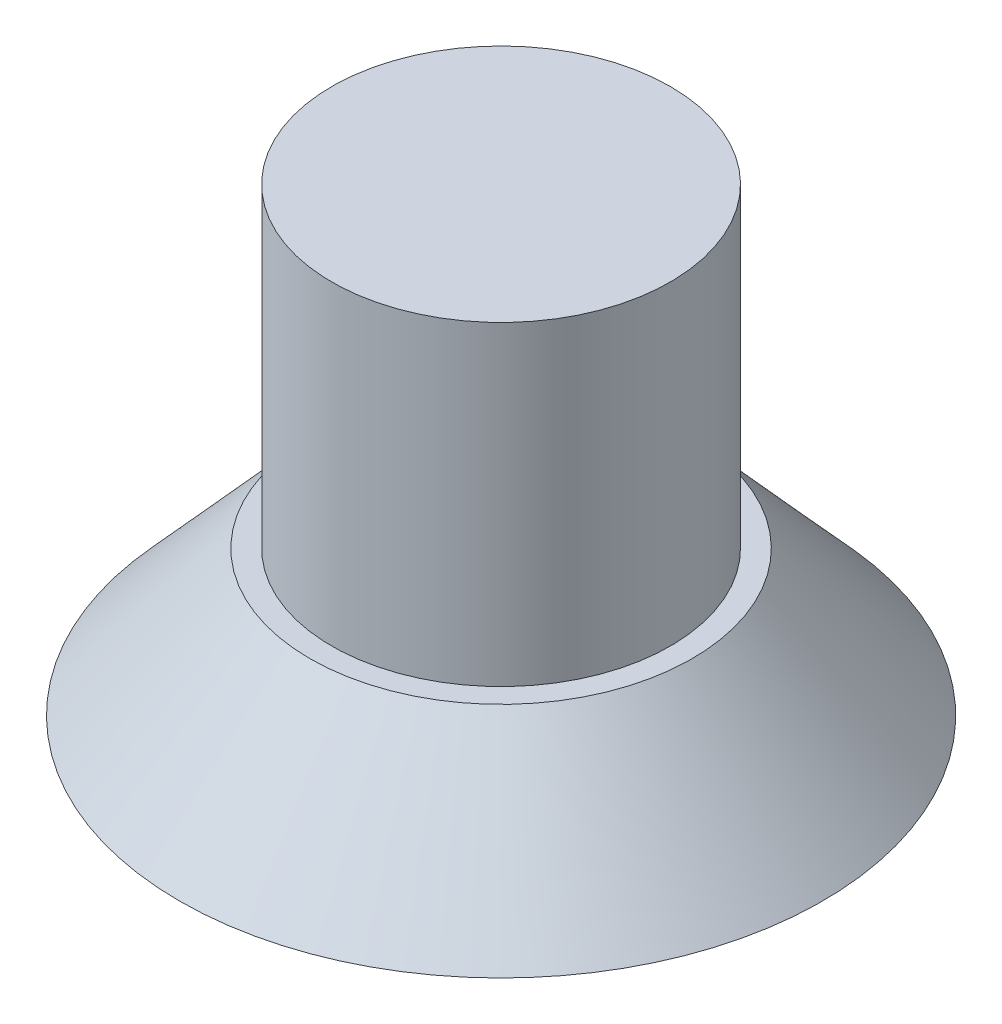
ISO-10303-21;
HEADER;
FILE_DESCRIPTION(('STEP AP214'),'2;1');
FILE_NAME('part.step','',(''),(''),'','','');
FILE_SCHEMA(('AUTOMOTIVE_DESIGN { 1 0 10303 214 1 1 1 1 }'));
ENDSEC;
DATA;
#1=APPLICATION_CONTEXT('core data for automotive mechanical design processes');
#2=APPLICATION_PROTOCOL_DEFINITION('international standard','automotive_design',2000,#1);
#3=PRODUCT_CONTEXT('',#1,'mechanical');
#4=PRODUCT('Part','Part','',(#3));
#5=PRODUCT_RELATED_PRODUCT_CATEGORY('part','',(#4));
#6=PRODUCT_DEFINITION_FORMATION('','',#4);
#7=PRODUCT_DEFINITION_CONTEXT('part definition',#1,'design');
#8=PRODUCT_DEFINITION('design','',#6,#7);
#9=PRODUCT_DEFINITION_SHAPE('','',#8);
#10=(LENGTH_UNIT() NAMED_UNIT(*) SI_UNIT(.MILLI.,.METRE.));
#11=(NAMED_UNIT(*) PLANE_ANGLE_UNIT() SI_UNIT($,.RADIAN.));
#12=(NAMED_UNIT(*) SI_UNIT($,.STERADIAN.) SOLID_ANGLE_UNIT());
#13=UNCERTAINTY_MEASURE_WITH_UNIT(LENGTH_MEASURE(1.E-05),#10,'distance_accuracy_value','');
#14=(GEOMETRIC_REPRESENTATION_CONTEXT(3) GLOBAL_UNCERTAINTY_ASSIGNED_CONTEXT((#13)) GLOBAL_UNIT_ASSIGNED_CONTEXT((#10,
#11,#12)) REPRESENTATION_CONTEXT('',''));
#15=CARTESIAN_POINT('',(0.,0.,0.));
#16=DIRECTION('',(0.,0.,1.));
#17=DIRECTION('',(1.,0.,0.));
#18=AXIS2_PLACEMENT_3D('',#15,#16,#17);
#19=CARTESIAN_POINT('',(0.,0.,0.));
#20=DIRECTION('',(0.,-1.,0.));
#21=DIRECTION('',(0.,0.,1.));
#22=AXIS2_PLACEMENT_3D('',#19,#20,#21);
#23=CONICAL_SURFACE('',#22,3.3274,0.73303828583762);
#24=CARTESIAN_POINT('',(0.,1.4986,0.));
#25=DIRECTION('',(0.,1.,0.));
#26=DIRECTION('',(0.,0.,1.));
#27=AXIS2_PLACEMENT_3D('',#24,#25,#26);
#28=CIRCLE('',#27,1.97805449921525);
#29=CARTESIAN_POINT('',(0.,1.4986,1.97805449921525));
#30=VERTEX_POINT('',#29);
#31=EDGE_CURVE('E36',#30,#30,#28,.T.);
#32=ORIENTED_EDGE('',*,*,#31,.F.);
#33=EDGE_LOOP('',(#32));
#34=FACE_BOUND('',#33,.T.);
#35=CARTESIAN_POINT('',(0.,0.,0.));
#36=DIRECTION('',(0.,1.,0.));
#37=DIRECTION('',(0.,0.,1.));
#38=AXIS2_PLACEMENT_3D('',#35,#36,#37);
#39=CIRCLE('',#38,3.3274);
#40=CARTESIAN_POINT('',(0.,0.,3.3274));
#41=VERTEX_POINT('',#40);
#42=EDGE_CURVE('E44',#41,#41,#39,.T.);
#43=ORIENTED_EDGE('',*,*,#42,.T.);
#44=EDGE_LOOP('',(#43));
#45=FACE_BOUND('',#44,.T.);
#46=ADVANCED_FACE('F33',(#34,#45),#23,.T.);
#47=CARTESIAN_POINT('',(0.,1.4986,0.));
#48=DIRECTION('',(0.,1.,0.));
#49=DIRECTION('',(0.,0.,1.));
#50=AXIS2_PLACEMENT_3D('',#47,#48,#49);
#51=PLANE('',#50);
#52=CARTESIAN_POINT('',(0.,1.4986,0.));
#53=DIRECTION('',(0.,1.,0.));
#54=DIRECTION('',(0.,0.,1.));
#55=AXIS2_PLACEMENT_3D('',#52,#53,#54);
#56=CIRCLE('',#55,1.7526);
#57=CARTESIAN_POINT('',(0.,1.4986,-1.7526));
#58=VERTEX_POINT('',#57);
#59=EDGE_CURVE('E10',#58,#58,#56,.T.);
#60=ORIENTED_EDGE('',*,*,#59,.F.);
#61=EDGE_LOOP('',(#60));
#62=FACE_BOUND('',#61,.T.);
#63=ORIENTED_EDGE('',*,*,#31,.T.);
#64=EDGE_LOOP('',(#63));
#65=FACE_BOUND('',#64,.T.);
#66=ADVANCED_FACE('F64',(#62,#65),#51,.T.);
#67=CARTESIAN_POINT('',(0.,0.,0.));
#68=DIRECTION('',(0.,1.,0.));
#69=DIRECTION('',(0.,0.,1.));
#70=AXIS2_PLACEMENT_3D('',#67,#68,#69);
#71=PLANE('',#70);
#72=ORIENTED_EDGE('',*,*,#42,.F.);
#73=EDGE_LOOP('',(#72));
#74=FACE_BOUND('',#73,.T.);
#75=ADVANCED_FACE('F57',(#74),#71,.F.);
#76=CARTESIAN_POINT('',(0.,4.7625,0.));
#77=DIRECTION('',(0.,-1.,0.));
#78=DIRECTION('',(0.,0.,-1.));
#79=AXIS2_PLACEMENT_3D('',#76,#77,#78);
#80=CYLINDRICAL_SURFACE('',#79,1.7526);
#81=CARTESIAN_POINT('',(0.,4.7625,0.));
#82=DIRECTION('',(0.,1.,0.));
#83=DIRECTION('',(0.,0.,1.));
#84=AXIS2_PLACEMENT_3D('',#81,#82,#83);
#85=CIRCLE('',#84,1.7526);
#86=CARTESIAN_POINT('',(0.,4.7625,-1.7526));
#87=VERTEX_POINT('',#86);
#88=EDGE_CURVE('E46',#87,#87,#85,.T.);
#89=CARTESIAN_POINT('',(0.,4.7625,-1.7526));
#90=CARTESIAN_POINT('',(0.,4.72850104166667,-1.7526));
#91=CARTESIAN_POINT('',(0.,4.69450208333333,-1.7526));
#92=CARTESIAN_POINT('',(0.,4.62650416666667,-1.7526));
#93=CARTESIAN_POINT('',(0.,4.59250520833333,-1.7526));
#94=CARTESIAN_POINT('',(0.,4.52450729166667,-1.7526));
#95=CARTESIAN_POINT('',(0.,4.49050833333333,-1.7526));
#96=CARTESIAN_POINT('',(0.,4.42251041666667,-1.7526));
#97=CARTESIAN_POINT('',(0.,4.38851145833333,-1.7526));
#98=CARTESIAN_POINT('',(0.,4.32051354166667,-1.7526));
#99=CARTESIAN_POINT('',(0.,4.28651458333333,-1.7526));
#100=CARTESIAN_POINT('',(0.,4.21851666666667,-1.7526));
#101=CARTESIAN_POINT('',(0.,4.18451770833333,-1.7526));
#102=CARTESIAN_POINT('',(0.,4.11651979166667,-1.7526));
#103=CARTESIAN_POINT('',(0.,4.08252083333333,-1.7526));
#104=CARTESIAN_POINT('',(0.,4.01452291666667,-1.7526));
#105=CARTESIAN_POINT('',(0.,3.98052395833333,-1.7526));
#106=CARTESIAN_POINT('',(0.,3.91252604166667,-1.7526));
#107=CARTESIAN_POINT('',(0.,3.87852708333333,-1.7526));
#108=CARTESIAN_POINT('',(0.,3.81052916666667,-1.7526));
#109=CARTESIAN_POINT('',(0.,3.77653020833333,-1.7526));
#110=CARTESIAN_POINT('',(0.,3.70853229166667,-1.7526));
#111=CARTESIAN_POINT('',(0.,3.67453333333333,-1.7526));
#112=CARTESIAN_POINT('',(0.,3.60653541666667,-1.7526));
#113=CARTESIAN_POINT('',(0.,3.57253645833333,-1.7526));
#114=CARTESIAN_POINT('',(0.,3.50453854166667,-1.7526));
#115=CARTESIAN_POINT('',(0.,3.47053958333333,-1.7526));
#116=CARTESIAN_POINT('',(0.,3.40254166666667,-1.7526));
#117=CARTESIAN_POINT('',(0.,3.36854270833333,-1.7526));
#118=CARTESIAN_POINT('',(0.,3.30054479166667,-1.7526));
#119=CARTESIAN_POINT('',(0.,3.26654583333333,-1.7526));
#120=CARTESIAN_POINT('',(0.,3.19854791666667,-1.7526));
#121=CARTESIAN_POINT('',(0.,3.16454895833333,-1.7526));
#122=CARTESIAN_POINT('',(0.,3.09655104166667,-1.7526));
#123=CARTESIAN_POINT('',(0.,3.06255208333333,-1.7526));
#124=CARTESIAN_POINT('',(0.,2.99455416666667,-1.7526));
#125=CARTESIAN_POINT('',(0.,2.96055520833333,-1.7526));
#126=CARTESIAN_POINT('',(0.,2.89255729166667,-1.7526));
#127=CARTESIAN_POINT('',(0.,2.85855833333333,-1.7526));
#128=CARTESIAN_POINT('',(0.,2.79056041666667,-1.7526));
#129=CARTESIAN_POINT('',(0.,2.75656145833333,-1.7526));
#130=CARTESIAN_POINT('',(0.,2.68856354166667,-1.7526));
#131=CARTESIAN_POINT('',(0.,2.65456458333333,-1.7526));
#132=CARTESIAN_POINT('',(0.,2.58656666666667,-1.7526));
#133=CARTESIAN_POINT('',(0.,2.55256770833333,-1.7526));
#134=CARTESIAN_POINT('',(0.,2.48456979166667,-1.7526));
#135=CARTESIAN_POINT('',(0.,2.45057083333333,-1.7526));
#136=CARTESIAN_POINT('',(0.,2.38257291666667,-1.7526));
#137=CARTESIAN_POINT('',(0.,2.34857395833333,-1.7526));
#138=CARTESIAN_POINT('',(0.,2.28057604166667,-1.7526));
#139=CARTESIAN_POINT('',(0.,2.24657708333333,-1.7526));
#140=CARTESIAN_POINT('',(0.,2.17857916666667,-1.7526));
#141=CARTESIAN_POINT('',(0.,2.14458020833333,-1.7526));
#142=CARTESIAN_POINT('',(0.,2.07658229166667,-1.7526));
#143=CARTESIAN_POINT('',(0.,2.04258333333333,-1.7526));
#144=CARTESIAN_POINT('',(0.,1.97458541666667,-1.7526));
#145=CARTESIAN_POINT('',(0.,1.94058645833333,-1.7526));
#146=CARTESIAN_POINT('',(0.,1.87258854166667,-1.7526));
#147=CARTESIAN_POINT('',(0.,1.83858958333333,-1.7526));
#148=CARTESIAN_POINT('',(0.,1.77059166666667,-1.7526));
#149=CARTESIAN_POINT('',(0.,1.73659270833333,-1.7526));
#150=CARTESIAN_POINT('',(0.,1.66859479166667,-1.7526));
#151=CARTESIAN_POINT('',(0.,1.63459583333333,-1.7526));
#152=CARTESIAN_POINT('',(0.,1.56659791666667,-1.7526));
#153=CARTESIAN_POINT('',(0.,1.53259895833333,-1.7526));
#154=CARTESIAN_POINT('',(0.,1.4986,-1.7526));
#155=B_SPLINE_CURVE_WITH_KNOTS('',3,(#89,#90,#91,#92,#93,#94,#95,#96,#97,#98,#99,#100,#101,#102,
#103,#104,#105,#106,#107,#108,#109,#110,#111,#112,#113,#114,#115,#116,#117,#118,#119,#120,#121,
#122,#123,#124,#125,#126,#127,#128,#129,#130,#131,#132,#133,#134,#135,#136,#137,#138,#139,#140,
#141,#142,#143,#144,#145,#146,#147,#148,#149,#150,#151,#152,#153,#154),.UNSPECIFIED.,.F.,.F.,(4,
2,2,2,2,2,2,2,2,2,2,2,2,2,2,2,2,2,2,2,2,2,2,2,2,2,2,2,2,2,2,2,4),(0.,0.101996875,0.20399375,
0.305990625,0.407987500000001,0.509984375,0.61198125,0.713978125,0.815975000000001,0.917971875,
1.01996875,1.121965625,1.2239625,1.325959375,1.42795625,1.529953125,1.63195,1.733946875,
1.83594375,1.937940625,2.0399375,2.141934375,2.24393125,2.345928125,2.447925,2.549921875,
2.65191875,2.753915625,2.8559125,2.957909375,3.05990625,3.161903125,3.2639),.UNSPECIFIED.);
#156=EDGE_CURVE('BSEAM55',#87,#58,#155,.T.);
#157=ORIENTED_EDGE('',*,*,#88,.F.);
#158=ORIENTED_EDGE('',*,*,#59,.T.);
#159=ORIENTED_EDGE('',*,*,#156,.T.);
#160=ORIENTED_EDGE('',*,*,#156,.F.);
#161=EDGE_LOOP('',(#157,#159,#158,#160));
#162=FACE_BOUND('',#161,.T.);
#163=ADVANCED_FACE('F55',(#162),#80,.T.);
#164=CARTESIAN_POINT('',(0.,4.7625,0.));
#165=DIRECTION('',(0.,1.,0.));
#166=DIRECTION('',(0.,0.,1.));
#167=AXIS2_PLACEMENT_3D('',#164,#165,#166);
#168=PLANE('',#167);
#169=ORIENTED_EDGE('',*,*,#88,.T.);
#170=EDGE_LOOP('',(#169));
#171=FACE_BOUND('',#170,.T.);
#172=ADVANCED_FACE('F53',(#171),#168,.T.);
#173=CLOSED_SHELL('',(#46,#66,#75,#163,#172));
#174=MANIFOLD_SOLID_BREP('B2',#173);
#175=ADVANCED_BREP_SHAPE_REPRESENTATION('',(#18,#174),#14);
#176=SHAPE_DEFINITION_REPRESENTATION(#9,#175);
ENDSEC;
END-ISO-10303-21;
